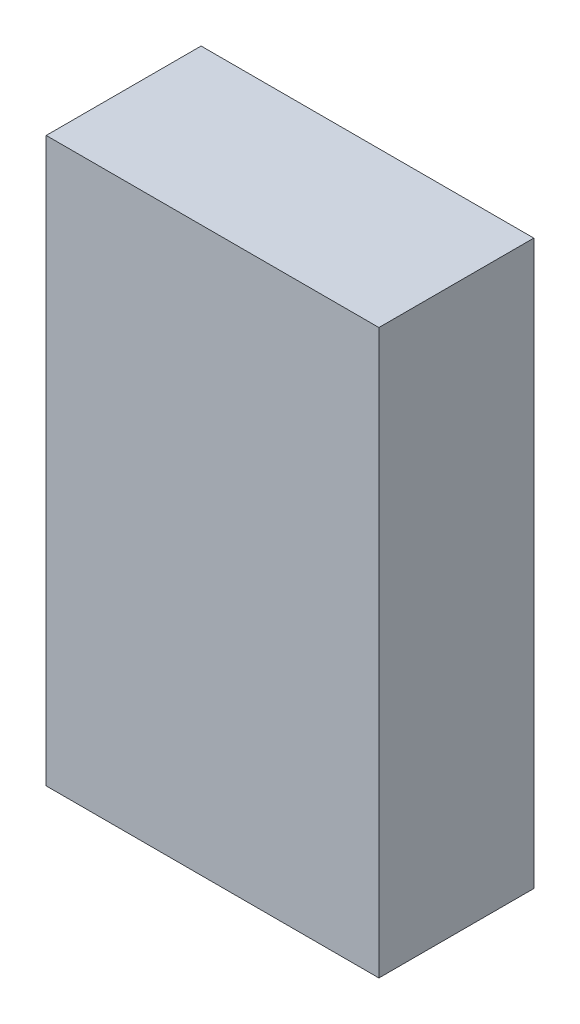
ISO-10303-21;
HEADER;
FILE_DESCRIPTION(('STEP AP214'),'2;1');
FILE_NAME('part.step','',(''),(''),'','','');
FILE_SCHEMA(('AUTOMOTIVE_DESIGN { 1 0 10303 214 1 1 1 1 }'));
ENDSEC;
DATA;
#1=APPLICATION_CONTEXT('core data for automotive mechanical design processes');
#2=APPLICATION_PROTOCOL_DEFINITION('international standard','automotive_design',2000,#1);
#3=PRODUCT_CONTEXT('',#1,'mechanical');
#4=PRODUCT('Part','Part','',(#3));
#5=PRODUCT_RELATED_PRODUCT_CATEGORY('part','',(#4));
#6=PRODUCT_DEFINITION_FORMATION('','',#4);
#7=PRODUCT_DEFINITION_CONTEXT('part definition',#1,'design');
#8=PRODUCT_DEFINITION('design','',#6,#7);
#9=PRODUCT_DEFINITION_SHAPE('','',#8);
#10=(LENGTH_UNIT() NAMED_UNIT(*) SI_UNIT(.MILLI.,.METRE.));
#11=(NAMED_UNIT(*) PLANE_ANGLE_UNIT() SI_UNIT($,.RADIAN.));
#12=(NAMED_UNIT(*) SI_UNIT($,.STERADIAN.) SOLID_ANGLE_UNIT());
#13=UNCERTAINTY_MEASURE_WITH_UNIT(LENGTH_MEASURE(1.E-05),#10,'distance_accuracy_value','');
#14=(GEOMETRIC_REPRESENTATION_CONTEXT(3) GLOBAL_UNCERTAINTY_ASSIGNED_CONTEXT((#13)) GLOBAL_UNIT_ASSIGNED_CONTEXT((#10,
#11,#12)) REPRESENTATION_CONTEXT('',''));
#15=CARTESIAN_POINT('',(0.,0.,0.));
#16=DIRECTION('',(0.,0.,1.));
#17=DIRECTION('',(1.,0.,0.));
#18=AXIS2_PLACEMENT_3D('',#15,#16,#17);
#19=CARTESIAN_POINT('',(35.34995824457,11.5638316019873,1.7018));
#20=DIRECTION('',(-1.,0.,0.));
#21=DIRECTION('',(0.,0.,1.));
#22=AXIS2_PLACEMENT_3D('',#19,#20,#21);
#23=PLANE('',#22);
#24=DIRECTION('',(0.,1.,0.));
#25=VECTOR('',#24,1.);
#26=CARTESIAN_POINT('',(35.34995824457,8.65434940875018,1.7018));
#27=LINE('',#26,#25);
#28=CARTESIAN_POINT('',(35.34995824457,8.65434940875018,1.7018));
#29=VERTEX_POINT('',#28);
#30=CARTESIAN_POINT('',(35.34995824457,11.5638316019873,1.7018));
#31=VERTEX_POINT('',#30);
#32=EDGE_CURVE('E113',#29,#31,#27,.T.);
#33=ORIENTED_EDGE('',*,*,#32,.F.);
#34=DIRECTION('',(0.,0.,1.));
#35=VECTOR('',#34,1.);
#36=CARTESIAN_POINT('',(35.34995824457,8.65434940875018,1.7018));
#37=LINE('',#36,#35);
#38=CARTESIAN_POINT('',(35.34995824457,8.65434940875018,2.5018));
#39=VERTEX_POINT('',#38);
#40=EDGE_CURVE('E70',#29,#39,#37,.T.);
#41=ORIENTED_EDGE('',*,*,#40,.T.);
#42=DIRECTION('',(0.,-1.,0.));
#43=VECTOR('',#42,1.);
#44=CARTESIAN_POINT('',(35.34995824457,8.65434940875018,2.5018));
#45=LINE('',#44,#43);
#46=CARTESIAN_POINT('',(35.34995824457,11.5638316019873,2.5018));
#47=VERTEX_POINT('',#46);
#48=EDGE_CURVE('E91',#47,#39,#45,.T.);
#49=ORIENTED_EDGE('',*,*,#48,.F.);
#50=DIRECTION('',(0.,0.,1.));
#51=VECTOR('',#50,1.);
#52=CARTESIAN_POINT('',(35.34995824457,11.5638316019873,1.7018));
#53=LINE('',#52,#51);
#54=EDGE_CURVE('E11',#31,#47,#53,.T.);
#55=ORIENTED_EDGE('',*,*,#54,.F.);
#56=EDGE_LOOP('',(#33,#41,#49,#55));
#57=FACE_BOUND('',#56,.T.);
#58=ADVANCED_FACE('F16',(#57),#23,.T.);
#59=CARTESIAN_POINT('',(37.0683101439314,11.5638316019873,1.7018));
#60=DIRECTION('',(0.,1.,0.));
#61=DIRECTION('',(1.,0.,0.));
#62=AXIS2_PLACEMENT_3D('',#59,#60,#61);
#63=PLANE('',#62);
#64=DIRECTION('',(1.,0.,0.));
#65=VECTOR('',#64,1.);
#66=CARTESIAN_POINT('',(35.34995824457,11.5638316019873,1.7018));
#67=LINE('',#66,#65);
#68=CARTESIAN_POINT('',(37.0683101439314,11.5638316019873,1.7018));
#69=VERTEX_POINT('',#68);
#70=EDGE_CURVE('E108',#31,#69,#67,.T.);
#71=ORIENTED_EDGE('',*,*,#70,.F.);
#72=ORIENTED_EDGE('',*,*,#54,.T.);
#73=DIRECTION('',(-1.,0.,0.));
#74=VECTOR('',#73,1.);
#75=CARTESIAN_POINT('',(35.34995824457,11.5638316019873,2.5018));
#76=LINE('',#75,#74);
#77=CARTESIAN_POINT('',(37.0683101439314,11.5638316019873,2.5018));
#78=VERTEX_POINT('',#77);
#79=EDGE_CURVE('E98',#78,#47,#76,.T.);
#80=ORIENTED_EDGE('',*,*,#79,.F.);
#81=DIRECTION('',(0.,0.,1.));
#82=VECTOR('',#81,1.);
#83=CARTESIAN_POINT('',(37.0683101439314,11.5638316019873,1.7018));
#84=LINE('',#83,#82);
#85=EDGE_CURVE('E27',#69,#78,#84,.T.);
#86=ORIENTED_EDGE('',*,*,#85,.F.);
#87=EDGE_LOOP('',(#71,#72,#80,#86));
#88=FACE_BOUND('',#87,.T.);
#89=ADVANCED_FACE('F201',(#88),#63,.T.);
#90=CARTESIAN_POINT('',(37.0683101439314,8.65434940875018,1.7018));
#91=DIRECTION('',(1.,0.,0.));
#92=DIRECTION('',(0.,1.,0.));
#93=AXIS2_PLACEMENT_3D('',#90,#91,#92);
#94=PLANE('',#93);
#95=DIRECTION('',(0.,-1.,0.));
#96=VECTOR('',#95,1.);
#97=CARTESIAN_POINT('',(37.0683101439314,11.5638316019873,1.7018));
#98=LINE('',#97,#96);
#99=CARTESIAN_POINT('',(37.0683101439314,8.65434940875018,1.7018));
#100=VERTEX_POINT('',#99);
#101=EDGE_CURVE('E102',#69,#100,#98,.T.);
#102=ORIENTED_EDGE('',*,*,#101,.F.);
#103=ORIENTED_EDGE('',*,*,#85,.T.);
#104=DIRECTION('',(0.,1.,0.));
#105=VECTOR('',#104,1.);
#106=CARTESIAN_POINT('',(37.0683101439314,11.5638316019873,2.5018));
#107=LINE('',#106,#105);
#108=CARTESIAN_POINT('',(37.0683101439314,8.65434940875018,2.5018));
#109=VERTEX_POINT('',#108);
#110=EDGE_CURVE('E94',#109,#78,#107,.T.);
#111=ORIENTED_EDGE('',*,*,#110,.F.);
#112=DIRECTION('',(0.,0.,1.));
#113=VECTOR('',#112,1.);
#114=CARTESIAN_POINT('',(37.0683101439314,8.65434940875018,1.7018));
#115=LINE('',#114,#113);
#116=EDGE_CURVE('E57',#100,#109,#115,.T.);
#117=ORIENTED_EDGE('',*,*,#116,.F.);
#118=EDGE_LOOP('',(#102,#103,#111,#117));
#119=FACE_BOUND('',#118,.T.);
#120=ADVANCED_FACE('F18',(#119),#94,.T.);
#121=CARTESIAN_POINT('',(35.34995824457,8.65434940875018,1.7018));
#122=DIRECTION('',(0.,-1.,0.));
#123=DIRECTION('',(0.,0.,-1.));
#124=AXIS2_PLACEMENT_3D('',#121,#122,#123);
#125=PLANE('',#124);
#126=DIRECTION('',(-1.,0.,0.));
#127=VECTOR('',#126,1.);
#128=CARTESIAN_POINT('',(37.0683101439314,8.65434940875018,1.7018));
#129=LINE('',#128,#127);
#130=EDGE_CURVE('E20',#100,#29,#129,.T.);
#131=ORIENTED_EDGE('',*,*,#130,.F.);
#132=ORIENTED_EDGE('',*,*,#116,.T.);
#133=DIRECTION('',(1.,0.,0.));
#134=VECTOR('',#133,1.);
#135=CARTESIAN_POINT('',(37.0683101439314,8.65434940875018,2.5018));
#136=LINE('',#135,#134);
#137=EDGE_CURVE('E88',#39,#109,#136,.T.);
#138=ORIENTED_EDGE('',*,*,#137,.F.);
#139=ORIENTED_EDGE('',*,*,#40,.F.);
#140=EDGE_LOOP('',(#131,#132,#138,#139));
#141=FACE_BOUND('',#140,.T.);
#142=ADVANCED_FACE('F86',(#141),#125,.T.);
#143=CARTESIAN_POINT('',(36.2091341942508,10.1090905053688,2.5018));
#144=DIRECTION('',(0.,0.,1.));
#145=DIRECTION('',(1.,0.,0.));
#146=AXIS2_PLACEMENT_3D('',#143,#144,#145);
#147=PLANE('',#146);
#148=ORIENTED_EDGE('',*,*,#137,.T.);
#149=ORIENTED_EDGE('',*,*,#110,.T.);
#150=ORIENTED_EDGE('',*,*,#79,.T.);
#151=ORIENTED_EDGE('',*,*,#48,.T.);
#152=EDGE_LOOP('',(#148,#149,#150,#151));
#153=FACE_BOUND('',#152,.T.);
#154=ADVANCED_FACE('F100',(#153),#147,.T.);
#155=CARTESIAN_POINT('',(36.2091341942508,10.1090905053688,1.7018));
#156=DIRECTION('',(0.,0.,1.));
#157=DIRECTION('',(1.,0.,0.));
#158=AXIS2_PLACEMENT_3D('',#155,#156,#157);
#159=PLANE('',#158);
#160=ORIENTED_EDGE('',*,*,#130,.T.);
#161=ORIENTED_EDGE('',*,*,#32,.T.);
#162=ORIENTED_EDGE('',*,*,#70,.T.);
#163=ORIENTED_EDGE('',*,*,#101,.T.);
#164=EDGE_LOOP('',(#160,#161,#162,#163));
#165=FACE_BOUND('',#164,.T.);
#166=ADVANCED_FACE('F196',(#165),#159,.F.);
#167=CLOSED_SHELL('',(#58,#89,#120,#142,#154,#166));
#168=MANIFOLD_SOLID_BREP('B1',#167);
#169=ADVANCED_BREP_SHAPE_REPRESENTATION('',(#18,#168),#14);
#170=SHAPE_DEFINITION_REPRESENTATION(#9,#169);
ENDSEC;
END-ISO-10303-21;
